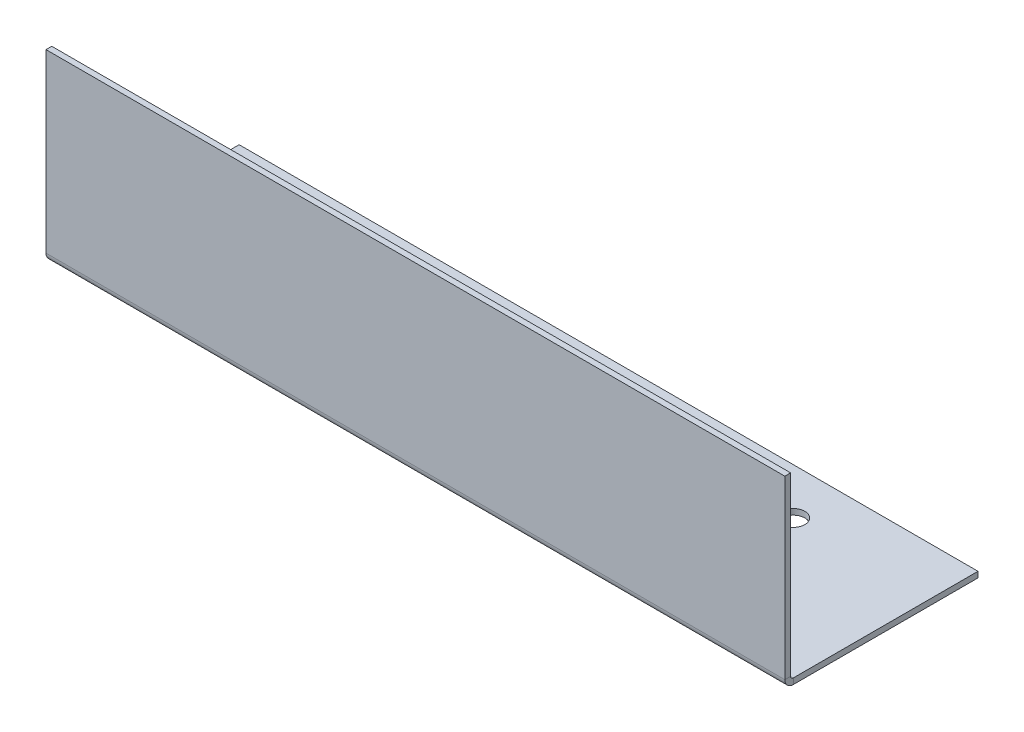
ISO-10303-21;
HEADER;
FILE_DESCRIPTION(('STEP AP214'),'2;1');
FILE_NAME('part.step','',(''),(''),'','','');
FILE_SCHEMA(('AUTOMOTIVE_DESIGN { 1 0 10303 214 1 1 1 1 }'));
ENDSEC;
DATA;
#1=APPLICATION_CONTEXT('core data for automotive mechanical design processes');
#2=APPLICATION_PROTOCOL_DEFINITION('international standard','automotive_design',2000,#1);
#3=PRODUCT_CONTEXT('',#1,'mechanical');
#4=PRODUCT('Part','Part','',(#3));
#5=PRODUCT_RELATED_PRODUCT_CATEGORY('part','',(#4));
#6=PRODUCT_DEFINITION_FORMATION('','',#4);
#7=PRODUCT_DEFINITION_CONTEXT('part definition',#1,'design');
#8=PRODUCT_DEFINITION('design','',#6,#7);
#9=PRODUCT_DEFINITION_SHAPE('','',#8);
#10=(LENGTH_UNIT() NAMED_UNIT(*) SI_UNIT(.MILLI.,.METRE.));
#11=(NAMED_UNIT(*) PLANE_ANGLE_UNIT() SI_UNIT($,.RADIAN.));
#12=(NAMED_UNIT(*) SI_UNIT($,.STERADIAN.) SOLID_ANGLE_UNIT());
#13=UNCERTAINTY_MEASURE_WITH_UNIT(LENGTH_MEASURE(1.E-05),#10,'distance_accuracy_value','');
#14=(GEOMETRIC_REPRESENTATION_CONTEXT(3) GLOBAL_UNCERTAINTY_ASSIGNED_CONTEXT((#13)) GLOBAL_UNIT_ASSIGNED_CONTEXT((#10,
#11,#12)) REPRESENTATION_CONTEXT('',''));
#15=CARTESIAN_POINT('',(0.,0.,0.));
#16=DIRECTION('',(0.,0.,1.));
#17=DIRECTION('',(1.,0.,0.));
#18=AXIS2_PLACEMENT_3D('',#15,#16,#17);
#19=CARTESIAN_POINT('',(-89.1272514830348,-1.5875,0.));
#20=DIRECTION('',(-1.,0.,0.));
#21=DIRECTION('',(0.,0.,1.));
#22=AXIS2_PLACEMENT_3D('',#19,#20,#21);
#23=PLANE('',#22);
#24=DIRECTION('',(0.,0.,1.));
#25=VECTOR('',#24,1.);
#26=CARTESIAN_POINT('',(-89.1272514830348,0.,0.));
#27=LINE('',#26,#25);
#28=CARTESIAN_POINT('',(-89.1272514830348,0.,-50.8));
#29=VERTEX_POINT('',#28);
#30=CARTESIAN_POINT('',(-89.1272514830348,0.,0.));
#31=VERTEX_POINT('',#30);
#32=EDGE_CURVE('E186',#29,#31,#27,.T.);
#33=ORIENTED_EDGE('',*,*,#32,.F.);
#34=DIRECTION('',(0.,1.,0.));
#35=VECTOR('',#34,1.);
#36=CARTESIAN_POINT('',(-89.1272514830348,-1.5875,-50.8));
#37=LINE('',#36,#35);
#38=CARTESIAN_POINT('',(-89.1272514830348,-1.5875,-50.8));
#39=VERTEX_POINT('',#38);
#40=EDGE_CURVE('E66',#39,#29,#37,.T.);
#41=ORIENTED_EDGE('',*,*,#40,.F.);
#42=DIRECTION('',(0.,0.,1.));
#43=VECTOR('',#42,1.);
#44=CARTESIAN_POINT('',(-89.1272514830348,-1.5875,0.));
#45=LINE('',#44,#43);
#46=CARTESIAN_POINT('',(-89.1272514830348,-1.5875,0.));
#47=VERTEX_POINT('',#46);
#48=EDGE_CURVE('E191',#39,#47,#45,.T.);
#49=ORIENTED_EDGE('',*,*,#48,.T.);
#50=DIRECTION('',(0.,1.,0.));
#51=VECTOR('',#50,1.);
#52=CARTESIAN_POINT('',(-89.1272514830348,-1.5875,0.));
#53=LINE('',#52,#51);
#54=EDGE_CURVE('E13',#47,#31,#53,.T.);
#55=ORIENTED_EDGE('',*,*,#54,.T.);
#56=EDGE_LOOP('',(#33,#41,#49,#55));
#57=FACE_BOUND('',#56,.T.);
#58=ADVANCED_FACE('F56',(#57),#23,.T.);
#59=CARTESIAN_POINT('',(-89.1272514830348,-1.5875,-50.8));
#60=DIRECTION('',(0.,0.,-1.));
#61=DIRECTION('',(-1.,0.,0.));
#62=AXIS2_PLACEMENT_3D('',#59,#60,#61);
#63=PLANE('',#62);
#64=DIRECTION('',(-1.,0.,0.));
#65=VECTOR('',#64,1.);
#66=CARTESIAN_POINT('',(-89.1272514830348,0.,-50.8));
#67=LINE('',#66,#65);
#68=CARTESIAN_POINT('',(114.072748516965,0.,-50.8));
#69=VERTEX_POINT('',#68);
#70=EDGE_CURVE('E198',#69,#29,#67,.T.);
#71=ORIENTED_EDGE('',*,*,#70,.F.);
#72=DIRECTION('',(0.,1.,0.));
#73=VECTOR('',#72,1.);
#74=CARTESIAN_POINT('',(114.072748516965,-1.5875,-50.8));
#75=LINE('',#74,#73);
#76=CARTESIAN_POINT('',(114.072748516965,-1.5875,-50.8));
#77=VERTEX_POINT('',#76);
#78=EDGE_CURVE('E99',#77,#69,#75,.T.);
#79=ORIENTED_EDGE('',*,*,#78,.F.);
#80=DIRECTION('',(-1.,0.,0.));
#81=VECTOR('',#80,1.);
#82=CARTESIAN_POINT('',(-89.1272514830348,-1.5875,-50.8));
#83=LINE('',#82,#81);
#84=EDGE_CURVE('E189',#77,#39,#83,.T.);
#85=ORIENTED_EDGE('',*,*,#84,.T.);
#86=ORIENTED_EDGE('',*,*,#40,.T.);
#87=EDGE_LOOP('',(#71,#79,#85,#86));
#88=FACE_BOUND('',#87,.T.);
#89=ADVANCED_FACE('F256',(#88),#63,.T.);
#90=CARTESIAN_POINT('',(114.072748516965,-1.5875,-50.8));
#91=DIRECTION('',(1.,0.,0.));
#92=DIRECTION('',(0.,0.,-1.));
#93=AXIS2_PLACEMENT_3D('',#90,#91,#92);
#94=PLANE('',#93);
#95=DIRECTION('',(0.,0.,-1.));
#96=VECTOR('',#95,1.);
#97=CARTESIAN_POINT('',(114.072748516965,0.,-50.8));
#98=LINE('',#97,#96);
#99=CARTESIAN_POINT('',(114.072748516965,0.,0.));
#100=VERTEX_POINT('',#99);
#101=EDGE_CURVE('E195',#100,#69,#98,.T.);
#102=ORIENTED_EDGE('',*,*,#101,.F.);
#103=DIRECTION('',(0.,1.,0.));
#104=VECTOR('',#103,1.);
#105=CARTESIAN_POINT('',(114.072748516965,-1.5875,0.));
#106=LINE('',#105,#104);
#107=CARTESIAN_POINT('',(114.072748516965,-1.58750000000001,0.));
#108=VERTEX_POINT('',#107);
#109=EDGE_CURVE('E60',#108,#100,#106,.T.);
#110=ORIENTED_EDGE('',*,*,#109,.F.);
#111=DIRECTION('',(0.,0.,-1.));
#112=VECTOR('',#111,1.);
#113=CARTESIAN_POINT('',(114.072748516965,-1.5875,-50.8));
#114=LINE('',#113,#112);
#115=EDGE_CURVE('E185',#108,#77,#114,.T.);
#116=ORIENTED_EDGE('',*,*,#115,.T.);
#117=ORIENTED_EDGE('',*,*,#78,.T.);
#118=EDGE_LOOP('',(#102,#110,#116,#117));
#119=FACE_BOUND('',#118,.T.);
#120=ADVANCED_FACE('F58',(#119),#94,.T.);
#121=CARTESIAN_POINT('',(0.,-1.5875,0.));
#122=DIRECTION('',(0.,-1.,0.));
#123=DIRECTION('',(0.,0.,-1.));
#124=AXIS2_PLACEMENT_3D('',#121,#122,#123);
#125=PLANE('',#124);
#126=CARTESIAN_POINT('',(75.9727485169652,-1.5875,-38.1));
#127=DIRECTION('',(0.,-1.,0.));
#128=DIRECTION('',(0.,0.,-1.));
#129=AXIS2_PLACEMENT_3D('',#126,#127,#128);
#130=CIRCLE('',#129,3.175);
#131=CARTESIAN_POINT('',(75.9727485169652,-1.5875,-41.275));
#132=VERTEX_POINT('',#131);
#133=EDGE_CURVE('E225',#132,#132,#130,.F.);
#134=ORIENTED_EDGE('',*,*,#133,.T.);
#135=EDGE_LOOP('',(#134));
#136=FACE_BOUND('',#135,.T.);
#137=CARTESIAN_POINT('',(-51.0272514830348,-1.5875,-12.7));
#138=DIRECTION('',(0.,-1.,0.));
#139=DIRECTION('',(0.,0.,-1.));
#140=AXIS2_PLACEMENT_3D('',#137,#138,#139);
#141=CIRCLE('',#140,3.175);
#142=CARTESIAN_POINT('',(-51.0272514830348,-1.5875,-15.875));
#143=VERTEX_POINT('',#142);
#144=EDGE_CURVE('E226',#143,#143,#141,.F.);
#145=ORIENTED_EDGE('',*,*,#144,.T.);
#146=EDGE_LOOP('',(#145));
#147=FACE_BOUND('',#146,.T.);
#148=CARTESIAN_POINT('',(75.9727485169652,-1.5875,-12.7));
#149=DIRECTION('',(0.,-1.,0.));
#150=DIRECTION('',(0.,0.,-1.));
#151=AXIS2_PLACEMENT_3D('',#148,#149,#150);
#152=CIRCLE('',#151,3.175);
#153=CARTESIAN_POINT('',(75.9727485169652,-1.5875,-15.875));
#154=VERTEX_POINT('',#153);
#155=EDGE_CURVE('E233',#154,#154,#152,.F.);
#156=ORIENTED_EDGE('',*,*,#155,.T.);
#157=EDGE_LOOP('',(#156));
#158=FACE_BOUND('',#157,.T.);
#159=CARTESIAN_POINT('',(-51.0272514830348,-1.5875,-38.1));
#160=DIRECTION('',(0.,-1.,0.));
#161=DIRECTION('',(0.,0.,-1.));
#162=AXIS2_PLACEMENT_3D('',#159,#160,#161);
#163=CIRCLE('',#162,3.175);
#164=CARTESIAN_POINT('',(-51.0272514830348,-1.5875,-41.275));
#165=VERTEX_POINT('',#164);
#166=EDGE_CURVE('E170',#165,#165,#163,.F.);
#167=ORIENTED_EDGE('',*,*,#166,.T.);
#168=EDGE_LOOP('',(#167));
#169=FACE_BOUND('',#168,.T.);
#170=DIRECTION('',(1.,0.,0.));
#171=VECTOR('',#170,1.);
#172=CARTESIAN_POINT('',(-89.1272514830348,-1.5875,0.));
#173=LINE('',#172,#171);
#174=EDGE_CURVE('E75',#47,#108,#173,.T.);
#175=ORIENTED_EDGE('',*,*,#174,.F.);
#176=ORIENTED_EDGE('',*,*,#48,.F.);
#177=ORIENTED_EDGE('',*,*,#84,.F.);
#178=ORIENTED_EDGE('',*,*,#115,.F.);
#179=EDGE_LOOP('',(#175,#176,#177,#178));
#180=FACE_BOUND('',#179,.T.);
#181=ADVANCED_FACE('F251',(#136,#147,#158,#169,#180),#125,.T.);
#182=CARTESIAN_POINT('',(0.,0.,0.));
#183=DIRECTION('',(0.,-1.,0.));
#184=DIRECTION('',(0.,0.,-1.));
#185=AXIS2_PLACEMENT_3D('',#182,#183,#184);
#186=PLANE('',#185);
#187=CARTESIAN_POINT('',(75.9727485169652,0.,-38.1));
#188=DIRECTION('',(0.,1.,0.));
#189=DIRECTION('',(0.,0.,1.));
#190=AXIS2_PLACEMENT_3D('',#187,#188,#189);
#191=CIRCLE('',#190,3.175);
#192=CARTESIAN_POINT('',(75.9727485169652,0.,-34.925));
#193=VERTEX_POINT('',#192);
#194=EDGE_CURVE('E229',#193,#193,#191,.T.);
#195=ORIENTED_EDGE('',*,*,#194,.F.);
#196=EDGE_LOOP('',(#195));
#197=FACE_BOUND('',#196,.T.);
#198=CARTESIAN_POINT('',(-51.0272514830348,0.,-12.7));
#199=DIRECTION('',(0.,1.,0.));
#200=DIRECTION('',(0.,0.,1.));
#201=AXIS2_PLACEMENT_3D('',#198,#199,#200);
#202=CIRCLE('',#201,3.175);
#203=CARTESIAN_POINT('',(-51.0272514830348,0.,-9.525));
#204=VERTEX_POINT('',#203);
#205=EDGE_CURVE('E230',#204,#204,#202,.T.);
#206=ORIENTED_EDGE('',*,*,#205,.F.);
#207=EDGE_LOOP('',(#206));
#208=FACE_BOUND('',#207,.T.);
#209=CARTESIAN_POINT('',(75.9727485169652,0.,-12.7));
#210=DIRECTION('',(0.,1.,0.));
#211=DIRECTION('',(0.,0.,1.));
#212=AXIS2_PLACEMENT_3D('',#209,#210,#211);
#213=CIRCLE('',#212,3.175);
#214=CARTESIAN_POINT('',(75.9727485169652,0.,-9.525));
#215=VERTEX_POINT('',#214);
#216=EDGE_CURVE('E240',#215,#215,#213,.T.);
#217=ORIENTED_EDGE('',*,*,#216,.F.);
#218=EDGE_LOOP('',(#217));
#219=FACE_BOUND('',#218,.T.);
#220=CARTESIAN_POINT('',(-51.0272514830348,0.,-38.1));
#221=DIRECTION('',(0.,1.,0.));
#222=DIRECTION('',(0.,0.,1.));
#223=AXIS2_PLACEMENT_3D('',#220,#221,#222);
#224=CIRCLE('',#223,3.175);
#225=CARTESIAN_POINT('',(-51.0272514830348,0.,-34.925));
#226=VERTEX_POINT('',#225);
#227=EDGE_CURVE('E222',#226,#226,#224,.T.);
#228=ORIENTED_EDGE('',*,*,#227,.F.);
#229=EDGE_LOOP('',(#228));
#230=FACE_BOUND('',#229,.T.);
#231=DIRECTION('',(1.,0.,0.));
#232=VECTOR('',#231,1.);
#233=CARTESIAN_POINT('',(-89.1272514830348,0.,0.));
#234=LINE('',#233,#232);
#235=EDGE_CURVE('E174',#31,#100,#234,.T.);
#236=ORIENTED_EDGE('',*,*,#235,.T.);
#237=ORIENTED_EDGE('',*,*,#101,.T.);
#238=ORIENTED_EDGE('',*,*,#70,.T.);
#239=ORIENTED_EDGE('',*,*,#32,.T.);
#240=EDGE_LOOP('',(#236,#237,#238,#239));
#241=FACE_BOUND('',#240,.T.);
#242=ADVANCED_FACE('F247',(#197,#208,#219,#230,#241),#186,.F.);
#243=CARTESIAN_POINT('',(-89.1272514830347,0.736599999999997,0.));
#244=DIRECTION('',(-1.,0.,0.));
#245=DIRECTION('',(0.,0.,1.));
#246=AXIS2_PLACEMENT_3D('',#243,#244,#245);
#247=PLANE('',#246);
#248=DIRECTION('',(0.,0.,-1.));
#249=VECTOR('',#248,1.);
#250=CARTESIAN_POINT('',(-89.1272514830348,0.736599999999997,2.3241));
#251=LINE('',#250,#249);
#252=CARTESIAN_POINT('',(-89.1272514830347,0.736599999999997,0.736599999999997));
#253=VERTEX_POINT('',#252);
#254=CARTESIAN_POINT('',(-89.1272514830347,0.736599999999997,2.3241));
#255=VERTEX_POINT('',#254);
#256=EDGE_CURVE('E153',#253,#255,#251,.F.);
#257=ORIENTED_EDGE('',*,*,#256,.F.);
#258=CARTESIAN_POINT('',(-89.1272514830347,0.736599999999997,0.));
#259=DIRECTION('',(1.,0.,0.));
#260=DIRECTION('',(0.,0.,-1.));
#261=AXIS2_PLACEMENT_3D('',#258,#259,#260);
#262=CIRCLE('',#261,0.736600000000005);
#263=EDGE_CURVE('E178',#31,#253,#262,.F.);
#264=ORIENTED_EDGE('',*,*,#263,.F.);
#265=ORIENTED_EDGE('',*,*,#54,.F.);
#266=CARTESIAN_POINT('',(-89.1272514830347,0.736599999999997,0.));
#267=DIRECTION('',(1.,0.,0.));
#268=DIRECTION('',(0.,0.,-1.));
#269=AXIS2_PLACEMENT_3D('',#266,#267,#268);
#270=CIRCLE('',#269,2.3241);
#271=EDGE_CURVE('E171',#47,#255,#270,.F.);
#272=ORIENTED_EDGE('',*,*,#271,.T.);
#273=EDGE_LOOP('',(#257,#264,#265,#272));
#274=FACE_BOUND('',#273,.T.);
#275=ADVANCED_FACE('F250',(#274),#247,.T.);
#276=CARTESIAN_POINT('',(114.072748516965,0.736599999999997,0.));
#277=DIRECTION('',(-1.,0.,0.));
#278=DIRECTION('',(0.,0.,1.));
#279=AXIS2_PLACEMENT_3D('',#276,#277,#278);
#280=PLANE('',#279);
#281=CARTESIAN_POINT('',(114.072748516965,0.736599999999997,0.));
#282=DIRECTION('',(1.,0.,0.));
#283=DIRECTION('',(0.,0.,-1.));
#284=AXIS2_PLACEMENT_3D('',#281,#282,#283);
#285=CIRCLE('',#284,0.736600000000005);
#286=CARTESIAN_POINT('',(114.072748516965,0.736599999999997,0.736600000000012));
#287=VERTEX_POINT('',#286);
#288=EDGE_CURVE('E181',#287,#100,#285,.T.);
#289=ORIENTED_EDGE('',*,*,#288,.F.);
#290=DIRECTION('',(0.,0.,-1.));
#291=VECTOR('',#290,1.);
#292=CARTESIAN_POINT('',(114.072748516965,0.736599999999997,0.7366));
#293=LINE('',#292,#291);
#294=CARTESIAN_POINT('',(114.072748516965,0.736599999999997,2.3241));
#295=VERTEX_POINT('',#294);
#296=EDGE_CURVE('E164',#287,#295,#293,.F.);
#297=ORIENTED_EDGE('',*,*,#296,.T.);
#298=CARTESIAN_POINT('',(114.072748516965,0.736599999999997,0.));
#299=DIRECTION('',(1.,0.,0.));
#300=DIRECTION('',(0.,0.,-1.));
#301=AXIS2_PLACEMENT_3D('',#298,#299,#300);
#302=CIRCLE('',#301,2.3241);
#303=EDGE_CURVE('E175',#295,#108,#302,.T.);
#304=ORIENTED_EDGE('',*,*,#303,.T.);
#305=ORIENTED_EDGE('',*,*,#109,.T.);
#306=EDGE_LOOP('',(#289,#297,#304,#305));
#307=FACE_BOUND('',#306,.T.);
#308=ADVANCED_FACE('F206',(#307),#280,.F.);
#309=CARTESIAN_POINT('',(114.072748516965,0.736599999999997,0.));
#310=DIRECTION('',(1.,0.,0.));
#311=DIRECTION('',(0.,0.,1.));
#312=AXIS2_PLACEMENT_3D('',#309,#310,#311);
#313=CYLINDRICAL_SURFACE('',#312,2.3241);
#314=ORIENTED_EDGE('',*,*,#174,.T.);
#315=ORIENTED_EDGE('',*,*,#303,.F.);
#316=DIRECTION('',(1.,0.,0.));
#317=VECTOR('',#316,1.);
#318=CARTESIAN_POINT('',(-89.1272514830348,0.736599999999997,2.3241));
#319=LINE('',#318,#317);
#320=EDGE_CURVE('E162',#295,#255,#319,.F.);
#321=ORIENTED_EDGE('',*,*,#320,.T.);
#322=ORIENTED_EDGE('',*,*,#271,.F.);
#323=EDGE_LOOP('',(#314,#315,#321,#322));
#324=FACE_BOUND('',#323,.T.);
#325=ADVANCED_FACE('F300',(#324),#313,.T.);
#326=CARTESIAN_POINT('',(114.072748516965,0.736599999999997,0.));
#327=DIRECTION('',(1.,0.,0.));
#328=DIRECTION('',(0.,0.,1.));
#329=AXIS2_PLACEMENT_3D('',#326,#327,#328);
#330=CYLINDRICAL_SURFACE('',#329,0.736600000000005);
#331=ORIENTED_EDGE('',*,*,#235,.F.);
#332=ORIENTED_EDGE('',*,*,#263,.T.);
#333=DIRECTION('',(1.,0.,0.));
#334=VECTOR('',#333,1.);
#335=CARTESIAN_POINT('',(-89.1272514830348,0.736599999999997,0.736599999999997));
#336=LINE('',#335,#334);
#337=EDGE_CURVE('E167',#253,#287,#336,.T.);
#338=ORIENTED_EDGE('',*,*,#337,.T.);
#339=ORIENTED_EDGE('',*,*,#288,.T.);
#340=EDGE_LOOP('',(#331,#332,#338,#339));
#341=FACE_BOUND('',#340,.T.);
#342=ADVANCED_FACE('F210',(#341),#330,.F.);
#343=CARTESIAN_POINT('',(-89.1272514830348,0.,2.3241));
#344=DIRECTION('',(1.,0.,0.));
#345=DIRECTION('',(0.,0.,-1.));
#346=AXIS2_PLACEMENT_3D('',#343,#344,#345);
#347=PLANE('',#346);
#348=ORIENTED_EDGE('',*,*,#256,.T.);
#349=DIRECTION('',(0.,-1.,0.));
#350=VECTOR('',#349,1.);
#351=CARTESIAN_POINT('',(-89.1272514830348,0.,2.3241));
#352=LINE('',#351,#350);
#353=CARTESIAN_POINT('',(-89.1272514830348,49.2125,2.3241));
#354=VERTEX_POINT('',#353);
#355=EDGE_CURVE('E134',#354,#255,#352,.T.);
#356=ORIENTED_EDGE('',*,*,#355,.F.);
#357=DIRECTION('',(0.,0.,-1.));
#358=VECTOR('',#357,1.);
#359=CARTESIAN_POINT('',(-89.1272514830348,49.2125,2.3241));
#360=LINE('',#359,#358);
#361=CARTESIAN_POINT('',(-89.1272514830348,49.2125,0.736599999999997));
#362=VERTEX_POINT('',#361);
#363=EDGE_CURVE('E140',#354,#362,#360,.T.);
#364=ORIENTED_EDGE('',*,*,#363,.T.);
#365=DIRECTION('',(0.,1.,0.));
#366=VECTOR('',#365,1.);
#367=CARTESIAN_POINT('',(-89.1272514830348,0.,0.736599999999997));
#368=LINE('',#367,#366);
#369=EDGE_CURVE('E160',#362,#253,#368,.F.);
#370=ORIENTED_EDGE('',*,*,#369,.T.);
#371=EDGE_LOOP('',(#348,#356,#364,#370));
#372=FACE_BOUND('',#371,.T.);
#373=ADVANCED_FACE('F152',(#372),#347,.F.);
#374=CARTESIAN_POINT('',(114.072748516965,49.2125,2.3241));
#375=DIRECTION('',(-1.,0.,0.));
#376=DIRECTION('',(0.,0.,1.));
#377=AXIS2_PLACEMENT_3D('',#374,#375,#376);
#378=PLANE('',#377);
#379=ORIENTED_EDGE('',*,*,#296,.F.);
#380=DIRECTION('',(0.,-1.,0.));
#381=VECTOR('',#380,1.);
#382=CARTESIAN_POINT('',(114.072748516965,49.2125,0.736599999999997));
#383=LINE('',#382,#381);
#384=CARTESIAN_POINT('',(114.072748516965,49.2125,0.736599999999997));
#385=VERTEX_POINT('',#384);
#386=EDGE_CURVE('E156',#287,#385,#383,.F.);
#387=ORIENTED_EDGE('',*,*,#386,.T.);
#388=DIRECTION('',(0.,0.,-1.));
#389=VECTOR('',#388,1.);
#390=CARTESIAN_POINT('',(114.072748516965,49.2125,2.3241));
#391=LINE('',#390,#389);
#392=CARTESIAN_POINT('',(114.072748516965,49.2125,2.3241));
#393=VERTEX_POINT('',#392);
#394=EDGE_CURVE('E149',#393,#385,#391,.T.);
#395=ORIENTED_EDGE('',*,*,#394,.F.);
#396=DIRECTION('',(0.,1.,0.));
#397=VECTOR('',#396,1.);
#398=CARTESIAN_POINT('',(114.072748516965,0.,2.3241));
#399=LINE('',#398,#397);
#400=EDGE_CURVE('E136',#295,#393,#399,.T.);
#401=ORIENTED_EDGE('',*,*,#400,.F.);
#402=EDGE_LOOP('',(#379,#387,#395,#401));
#403=FACE_BOUND('',#402,.T.);
#404=ADVANCED_FACE('F217',(#403),#378,.F.);
#405=CARTESIAN_POINT('',(0.,0.,2.3241));
#406=DIRECTION('',(0.,0.,-1.));
#407=DIRECTION('',(-1.,0.,0.));
#408=AXIS2_PLACEMENT_3D('',#405,#406,#407);
#409=PLANE('',#408);
#410=ORIENTED_EDGE('',*,*,#320,.F.);
#411=ORIENTED_EDGE('',*,*,#400,.T.);
#412=DIRECTION('',(-1.,0.,0.));
#413=VECTOR('',#412,1.);
#414=CARTESIAN_POINT('',(0.,49.2125,2.3241));
#415=LINE('',#414,#413);
#416=EDGE_CURVE('E129',#393,#354,#415,.T.);
#417=ORIENTED_EDGE('',*,*,#416,.T.);
#418=ORIENTED_EDGE('',*,*,#355,.T.);
#419=EDGE_LOOP('',(#410,#411,#417,#418));
#420=FACE_BOUND('',#419,.T.);
#421=ADVANCED_FACE('F132',(#420),#409,.F.);
#422=CARTESIAN_POINT('',(0.,0.,0.736599999999997));
#423=DIRECTION('',(0.,0.,-1.));
#424=DIRECTION('',(-1.,0.,0.));
#425=AXIS2_PLACEMENT_3D('',#422,#423,#424);
#426=PLANE('',#425);
#427=ORIENTED_EDGE('',*,*,#386,.F.);
#428=ORIENTED_EDGE('',*,*,#337,.F.);
#429=ORIENTED_EDGE('',*,*,#369,.F.);
#430=DIRECTION('',(1.,0.,0.));
#431=VECTOR('',#430,1.);
#432=CARTESIAN_POINT('',(-89.1272514830348,49.2125,0.736599999999997));
#433=LINE('',#432,#431);
#434=EDGE_CURVE('E145',#385,#362,#433,.F.);
#435=ORIENTED_EDGE('',*,*,#434,.F.);
#436=EDGE_LOOP('',(#427,#428,#429,#435));
#437=FACE_BOUND('',#436,.T.);
#438=ADVANCED_FACE('F215',(#437),#426,.T.);
#439=CARTESIAN_POINT('',(-89.1272514830348,49.2125,2.3241));
#440=DIRECTION('',(0.,-1.,0.));
#441=DIRECTION('',(0.,0.,-1.));
#442=AXIS2_PLACEMENT_3D('',#439,#440,#441);
#443=PLANE('',#442);
#444=ORIENTED_EDGE('',*,*,#434,.T.);
#445=ORIENTED_EDGE('',*,*,#363,.F.);
#446=ORIENTED_EDGE('',*,*,#416,.F.);
#447=ORIENTED_EDGE('',*,*,#394,.T.);
#448=EDGE_LOOP('',(#444,#445,#446,#447));
#449=FACE_BOUND('',#448,.T.);
#450=ADVANCED_FACE('F143',(#449),#443,.F.);
#451=CARTESIAN_POINT('',(-51.0272514830348,-10.5677561210691,-38.1));
#452=DIRECTION('',(0.,1.,0.));
#453=DIRECTION('',(0.,0.,1.));
#454=AXIS2_PLACEMENT_3D('',#451,#452,#453);
#455=CYLINDRICAL_SURFACE('',#454,3.175);
#456=ORIENTED_EDGE('',*,*,#227,.T.);
#457=EDGE_LOOP('',(#456));
#458=FACE_BOUND('',#457,.T.);
#459=ORIENTED_EDGE('',*,*,#166,.F.);
#460=EDGE_LOOP('',(#459));
#461=FACE_BOUND('',#460,.T.);
#462=ADVANCED_FACE('F363',(#458,#461),#455,.F.);
#463=CARTESIAN_POINT('',(75.9727485169652,-10.5677561210691,-12.7));
#464=DIRECTION('',(0.,1.,0.));
#465=DIRECTION('',(0.,0.,1.));
#466=AXIS2_PLACEMENT_3D('',#463,#464,#465);
#467=CYLINDRICAL_SURFACE('',#466,3.175);
#468=ORIENTED_EDGE('',*,*,#216,.T.);
#469=EDGE_LOOP('',(#468));
#470=FACE_BOUND('',#469,.T.);
#471=ORIENTED_EDGE('',*,*,#155,.F.);
#472=EDGE_LOOP('',(#471));
#473=FACE_BOUND('',#472,.T.);
#474=ADVANCED_FACE('F244',(#470,#473),#467,.F.);
#475=CARTESIAN_POINT('',(-51.0272514830348,-10.5677561210691,-12.7));
#476=DIRECTION('',(0.,1.,0.));
#477=DIRECTION('',(0.,0.,1.));
#478=AXIS2_PLACEMENT_3D('',#475,#476,#477);
#479=CYLINDRICAL_SURFACE('',#478,3.175);
#480=ORIENTED_EDGE('',*,*,#205,.T.);
#481=EDGE_LOOP('',(#480));
#482=FACE_BOUND('',#481,.T.);
#483=ORIENTED_EDGE('',*,*,#144,.F.);
#484=EDGE_LOOP('',(#483));
#485=FACE_BOUND('',#484,.T.);
#486=ADVANCED_FACE('F394',(#482,#485),#479,.F.);
#487=CARTESIAN_POINT('',(75.9727485169652,-10.5677561210691,-38.1));
#488=DIRECTION('',(0.,1.,0.));
#489=DIRECTION('',(0.,0.,1.));
#490=AXIS2_PLACEMENT_3D('',#487,#488,#489);
#491=CYLINDRICAL_SURFACE('',#490,3.175);
#492=ORIENTED_EDGE('',*,*,#194,.T.);
#493=EDGE_LOOP('',(#492));
#494=FACE_BOUND('',#493,.T.);
#495=ORIENTED_EDGE('',*,*,#133,.F.);
#496=EDGE_LOOP('',(#495));
#497=FACE_BOUND('',#496,.T.);
#498=ADVANCED_FACE('F404',(#494,#497),#491,.F.);
#499=CLOSED_SHELL('',(#58,#89,#120,#181,#242,#275,#308,#325,#342,#373,#404,#421,#438,#450,#462,
#474,#486,#498));
#500=MANIFOLD_SOLID_BREP('B2',#499);
#501=ADVANCED_BREP_SHAPE_REPRESENTATION('',(#18,#500),#14);
#502=SHAPE_DEFINITION_REPRESENTATION(#9,#501);
ENDSEC;
END-ISO-10303-21;
